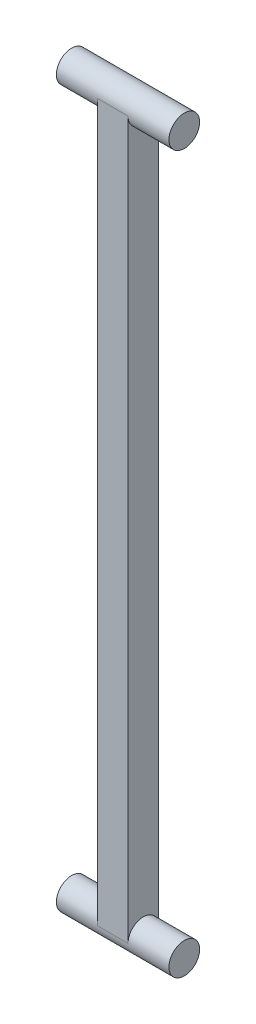
ISO-10303-21;
HEADER;
FILE_DESCRIPTION(('STEP AP214'),'2;1');
FILE_NAME('part.step','',(''),(''),'','','');
FILE_SCHEMA(('AUTOMOTIVE_DESIGN { 1 0 10303 214 1 1 1 1 }'));
ENDSEC;
DATA;
#1=APPLICATION_CONTEXT('core data for automotive mechanical design processes');
#2=APPLICATION_PROTOCOL_DEFINITION('international standard','automotive_design',2000,#1);
#3=PRODUCT_CONTEXT('',#1,'mechanical');
#4=PRODUCT('Part','Part','',(#3));
#5=PRODUCT_RELATED_PRODUCT_CATEGORY('part','',(#4));
#6=PRODUCT_DEFINITION_FORMATION('','',#4);
#7=PRODUCT_DEFINITION_CONTEXT('part definition',#1,'design');
#8=PRODUCT_DEFINITION('design','',#6,#7);
#9=PRODUCT_DEFINITION_SHAPE('','',#8);
#10=(LENGTH_UNIT() NAMED_UNIT(*) SI_UNIT(.MILLI.,.METRE.));
#11=(NAMED_UNIT(*) PLANE_ANGLE_UNIT() SI_UNIT($,.RADIAN.));
#12=(NAMED_UNIT(*) SI_UNIT($,.STERADIAN.) SOLID_ANGLE_UNIT());
#13=UNCERTAINTY_MEASURE_WITH_UNIT(LENGTH_MEASURE(1.E-05),#10,'distance_accuracy_value','');
#14=(GEOMETRIC_REPRESENTATION_CONTEXT(3) GLOBAL_UNCERTAINTY_ASSIGNED_CONTEXT((#13)) GLOBAL_UNIT_ASSIGNED_CONTEXT((#10,
#11,#12)) REPRESENTATION_CONTEXT('',''));
#15=CARTESIAN_POINT('',(0.,0.,0.));
#16=DIRECTION('',(0.,0.,1.));
#17=DIRECTION('',(1.,0.,0.));
#18=AXIS2_PLACEMENT_3D('',#15,#16,#17);
#19=CARTESIAN_POINT('',(15.,175.,30.));
#20=DIRECTION('',(-1.,0.,0.));
#21=DIRECTION('',(0.,-1.,0.));
#22=AXIS2_PLACEMENT_3D('',#19,#20,#21);
#23=PLANE('',#22);
#24=DIRECTION('',(0.,1.,0.));
#25=VECTOR('',#24,1.);
#26=CARTESIAN_POINT('',(15.,175.,30.));
#27=LINE('',#26,#25);
#28=CARTESIAN_POINT('',(15.,-175.,30.));
#29=VERTEX_POINT('',#28);
#30=CARTESIAN_POINT('',(15.,525.,30.));
#31=VERTEX_POINT('',#30);
#32=EDGE_CURVE('E124',#29,#31,#27,.T.);
#33=ORIENTED_EDGE('',*,*,#32,.F.);
#34=CARTESIAN_POINT('',(15.,-175.,15.));
#35=DIRECTION('',(-1.,0.,0.));
#36=DIRECTION('',(0.,-1.,0.));
#37=AXIS2_PLACEMENT_3D('',#34,#35,#36);
#38=CIRCLE('',#37,15.);
#39=CARTESIAN_POINT('',(15.,-175.,0.));
#40=VERTEX_POINT('',#39);
#41=EDGE_CURVE('E81',#29,#40,#38,.T.);
#42=ORIENTED_EDGE('',*,*,#41,.T.);
#43=DIRECTION('',(0.,1.,0.));
#44=VECTOR('',#43,1.);
#45=CARTESIAN_POINT('',(15.,175.,0.));
#46=LINE('',#45,#44);
#47=CARTESIAN_POINT('',(15.,525.,0.));
#48=VERTEX_POINT('',#47);
#49=EDGE_CURVE('E76',#40,#48,#46,.T.);
#50=ORIENTED_EDGE('',*,*,#49,.T.);
#51=CARTESIAN_POINT('',(15.,525.,15.));
#52=DIRECTION('',(1.,0.,0.));
#53=DIRECTION('',(0.,1.,0.));
#54=AXIS2_PLACEMENT_3D('',#51,#52,#53);
#55=CIRCLE('',#54,15.);
#56=EDGE_CURVE('E79',#31,#48,#55,.T.);
#57=ORIENTED_EDGE('',*,*,#56,.F.);
#58=EDGE_LOOP('',(#33,#42,#50,#57));
#59=FACE_BOUND('',#58,.T.);
#60=ADVANCED_FACE('F39',(#59),#23,.F.);
#61=CARTESIAN_POINT('',(-15.,175.,30.));
#62=DIRECTION('',(1.,0.,0.));
#63=DIRECTION('',(0.,1.,0.));
#64=AXIS2_PLACEMENT_3D('',#61,#62,#63);
#65=PLANE('',#64);
#66=DIRECTION('',(0.,-1.,0.));
#67=VECTOR('',#66,1.);
#68=CARTESIAN_POINT('',(-15.,175.,0.));
#69=LINE('',#68,#67);
#70=CARTESIAN_POINT('',(-15.,525.,0.));
#71=VERTEX_POINT('',#70);
#72=CARTESIAN_POINT('',(-15.,-175.,0.));
#73=VERTEX_POINT('',#72);
#74=EDGE_CURVE('E86',#71,#73,#69,.T.);
#75=ORIENTED_EDGE('',*,*,#74,.T.);
#76=CARTESIAN_POINT('',(-15.,-175.,15.));
#77=DIRECTION('',(1.,0.,0.));
#78=DIRECTION('',(0.,1.,0.));
#79=AXIS2_PLACEMENT_3D('',#76,#77,#78);
#80=CIRCLE('',#79,15.);
#81=CARTESIAN_POINT('',(-15.,-175.,30.));
#82=VERTEX_POINT('',#81);
#83=EDGE_CURVE('E119',#73,#82,#80,.T.);
#84=ORIENTED_EDGE('',*,*,#83,.T.);
#85=DIRECTION('',(0.,-1.,0.));
#86=VECTOR('',#85,1.);
#87=CARTESIAN_POINT('',(-15.,175.,30.));
#88=LINE('',#87,#86);
#89=CARTESIAN_POINT('',(-15.,525.,30.));
#90=VERTEX_POINT('',#89);
#91=EDGE_CURVE('E49',#90,#82,#88,.T.);
#92=ORIENTED_EDGE('',*,*,#91,.F.);
#93=CARTESIAN_POINT('',(-15.,525.,15.));
#94=DIRECTION('',(-1.,0.,0.));
#95=DIRECTION('',(0.,-1.,0.));
#96=AXIS2_PLACEMENT_3D('',#93,#94,#95);
#97=CIRCLE('',#96,15.);
#98=EDGE_CURVE('E102',#71,#90,#97,.T.);
#99=ORIENTED_EDGE('',*,*,#98,.F.);
#100=EDGE_LOOP('',(#75,#84,#92,#99));
#101=FACE_BOUND('',#100,.T.);
#102=ADVANCED_FACE('F134',(#101),#65,.F.);
#103=CARTESIAN_POINT('',(0.,0.,30.));
#104=DIRECTION('',(0.,0.,1.));
#105=DIRECTION('',(1.,0.,0.));
#106=AXIS2_PLACEMENT_3D('',#103,#104,#105);
#107=PLANE('',#106);
#108=ORIENTED_EDGE('',*,*,#32,.T.);
#109=DIRECTION('',(1.,0.,0.));
#110=VECTOR('',#109,1.);
#111=CARTESIAN_POINT('',(-15.,525.,30.));
#112=LINE('',#111,#110);
#113=EDGE_CURVE('E96',#90,#31,#112,.T.);
#114=ORIENTED_EDGE('',*,*,#113,.F.);
#115=ORIENTED_EDGE('',*,*,#91,.T.);
#116=DIRECTION('',(1.,0.,0.));
#117=VECTOR('',#116,1.);
#118=CARTESIAN_POINT('',(-15.,-175.,30.));
#119=LINE('',#118,#117);
#120=EDGE_CURVE('E11',#82,#29,#119,.T.);
#121=ORIENTED_EDGE('',*,*,#120,.T.);
#122=EDGE_LOOP('',(#108,#114,#115,#121));
#123=FACE_BOUND('',#122,.T.);
#124=ADVANCED_FACE('F135',(#123),#107,.T.);
#125=CARTESIAN_POINT('',(0.,0.,0.));
#126=DIRECTION('',(0.,0.,1.));
#127=DIRECTION('',(1.,0.,0.));
#128=AXIS2_PLACEMENT_3D('',#125,#126,#127);
#129=PLANE('',#128);
#130=ORIENTED_EDGE('',*,*,#49,.F.);
#131=DIRECTION('',(1.,0.,0.));
#132=VECTOR('',#131,1.);
#133=CARTESIAN_POINT('',(-15.,-175.,0.));
#134=LINE('',#133,#132);
#135=EDGE_CURVE('E42',#73,#40,#134,.T.);
#136=ORIENTED_EDGE('',*,*,#135,.F.);
#137=ORIENTED_EDGE('',*,*,#74,.F.);
#138=DIRECTION('',(1.,0.,0.));
#139=VECTOR('',#138,1.);
#140=CARTESIAN_POINT('',(-15.,525.,0.));
#141=LINE('',#140,#139);
#142=EDGE_CURVE('E89',#71,#48,#141,.T.);
#143=ORIENTED_EDGE('',*,*,#142,.T.);
#144=EDGE_LOOP('',(#130,#136,#137,#143));
#145=FACE_BOUND('',#144,.T.);
#146=ADVANCED_FACE('F90',(#145),#129,.F.);
#147=CARTESIAN_POINT('',(-55.,-175.,15.));
#148=DIRECTION('',(1.,0.,0.));
#149=DIRECTION('',(0.,1.,0.));
#150=AXIS2_PLACEMENT_3D('',#147,#148,#149);
#151=CYLINDRICAL_SURFACE('',#150,15.);
#152=CARTESIAN_POINT('',(55.,-175.,15.));
#153=DIRECTION('',(1.,0.,0.));
#154=DIRECTION('',(0.,1.,0.));
#155=AXIS2_PLACEMENT_3D('',#152,#153,#154);
#156=CIRCLE('',#155,15.);
#157=CARTESIAN_POINT('',(55.,-160.,15.));
#158=VERTEX_POINT('',#157);
#159=EDGE_CURVE('E110',#158,#158,#156,.T.);
#160=ORIENTED_EDGE('',*,*,#159,.F.);
#161=EDGE_LOOP('',(#160));
#162=FACE_BOUND('',#161,.T.);
#163=CARTESIAN_POINT('',(-55.,-175.,15.));
#164=DIRECTION('',(1.,0.,0.));
#165=DIRECTION('',(0.,1.,0.));
#166=AXIS2_PLACEMENT_3D('',#163,#164,#165);
#167=CIRCLE('',#166,15.);
#168=CARTESIAN_POINT('',(-55.,-160.,15.));
#169=VERTEX_POINT('',#168);
#170=EDGE_CURVE('E115',#169,#169,#167,.T.);
#171=ORIENTED_EDGE('',*,*,#170,.T.);
#172=EDGE_LOOP('',(#171));
#173=FACE_BOUND('',#172,.T.);
#174=ORIENTED_EDGE('',*,*,#120,.F.);
#175=ORIENTED_EDGE('',*,*,#83,.F.);
#176=ORIENTED_EDGE('',*,*,#135,.T.);
#177=ORIENTED_EDGE('',*,*,#41,.F.);
#178=EDGE_LOOP('',(#174,#175,#176,#177));
#179=FACE_BOUND('',#178,.T.);
#180=ADVANCED_FACE('F133',(#162,#173,#179),#151,.T.);
#181=CARTESIAN_POINT('',(-55.,-175.,15.));
#182=DIRECTION('',(1.,0.,0.));
#183=DIRECTION('',(0.,1.,0.));
#184=AXIS2_PLACEMENT_3D('',#181,#182,#183);
#185=PLANE('',#184);
#186=ORIENTED_EDGE('',*,*,#170,.F.);
#187=EDGE_LOOP('',(#186));
#188=FACE_BOUND('',#187,.T.);
#189=ADVANCED_FACE('F204',(#188),#185,.F.);
#190=CARTESIAN_POINT('',(55.,-175.,15.));
#191=DIRECTION('',(1.,0.,0.));
#192=DIRECTION('',(0.,1.,0.));
#193=AXIS2_PLACEMENT_3D('',#190,#191,#192);
#194=PLANE('',#193);
#195=ORIENTED_EDGE('',*,*,#159,.T.);
#196=EDGE_LOOP('',(#195));
#197=FACE_BOUND('',#196,.T.);
#198=ADVANCED_FACE('F176',(#197),#194,.T.);
#199=CARTESIAN_POINT('',(-55.,525.,15.));
#200=DIRECTION('',(1.,0.,0.));
#201=DIRECTION('',(0.,-1.,0.));
#202=AXIS2_PLACEMENT_3D('',#199,#200,#201);
#203=CYLINDRICAL_SURFACE('',#202,15.);
#204=CARTESIAN_POINT('',(55.,525.,15.));
#205=DIRECTION('',(-1.,0.,0.));
#206=DIRECTION('',(0.,-1.,0.));
#207=AXIS2_PLACEMENT_3D('',#204,#205,#206);
#208=CIRCLE('',#207,15.);
#209=CARTESIAN_POINT('',(55.,510.,15.));
#210=VERTEX_POINT('',#209);
#211=EDGE_CURVE('E241',#210,#210,#208,.T.);
#212=ORIENTED_EDGE('',*,*,#211,.T.);
#213=EDGE_LOOP('',(#212));
#214=FACE_BOUND('',#213,.T.);
#215=CARTESIAN_POINT('',(-55.,525.,15.));
#216=DIRECTION('',(-1.,0.,0.));
#217=DIRECTION('',(0.,-1.,0.));
#218=AXIS2_PLACEMENT_3D('',#215,#216,#217);
#219=CIRCLE('',#218,15.);
#220=CARTESIAN_POINT('',(-55.,510.,15.));
#221=VERTEX_POINT('',#220);
#222=EDGE_CURVE('E105',#221,#221,#219,.T.);
#223=ORIENTED_EDGE('',*,*,#222,.F.);
#224=EDGE_LOOP('',(#223));
#225=FACE_BOUND('',#224,.T.);
#226=ORIENTED_EDGE('',*,*,#113,.T.);
#227=ORIENTED_EDGE('',*,*,#56,.T.);
#228=ORIENTED_EDGE('',*,*,#142,.F.);
#229=ORIENTED_EDGE('',*,*,#98,.T.);
#230=EDGE_LOOP('',(#226,#227,#228,#229));
#231=FACE_BOUND('',#230,.T.);
#232=ADVANCED_FACE('F99',(#214,#225,#231),#203,.T.);
#233=CARTESIAN_POINT('',(-55.,525.,15.));
#234=DIRECTION('',(1.,0.,0.));
#235=DIRECTION('',(0.,-1.,0.));
#236=AXIS2_PLACEMENT_3D('',#233,#234,#235);
#237=PLANE('',#236);
#238=ORIENTED_EDGE('',*,*,#222,.T.);
#239=EDGE_LOOP('',(#238));
#240=FACE_BOUND('',#239,.T.);
#241=ADVANCED_FACE('F175',(#240),#237,.F.);
#242=CARTESIAN_POINT('',(55.,525.,15.));
#243=DIRECTION('',(1.,0.,0.));
#244=DIRECTION('',(0.,-1.,0.));
#245=AXIS2_PLACEMENT_3D('',#242,#243,#244);
#246=PLANE('',#245);
#247=ORIENTED_EDGE('',*,*,#211,.F.);
#248=EDGE_LOOP('',(#247));
#249=FACE_BOUND('',#248,.T.);
#250=ADVANCED_FACE('F187',(#249),#246,.T.);
#251=CLOSED_SHELL('',(#60,#102,#124,#146,#180,#189,#198,#232,#241,#250));
#252=MANIFOLD_SOLID_BREP('B2',#251);
#253=ADVANCED_BREP_SHAPE_REPRESENTATION('',(#18,#252),#14);
#254=SHAPE_DEFINITION_REPRESENTATION(#9,#253);
ENDSEC;
END-ISO-10303-21;
